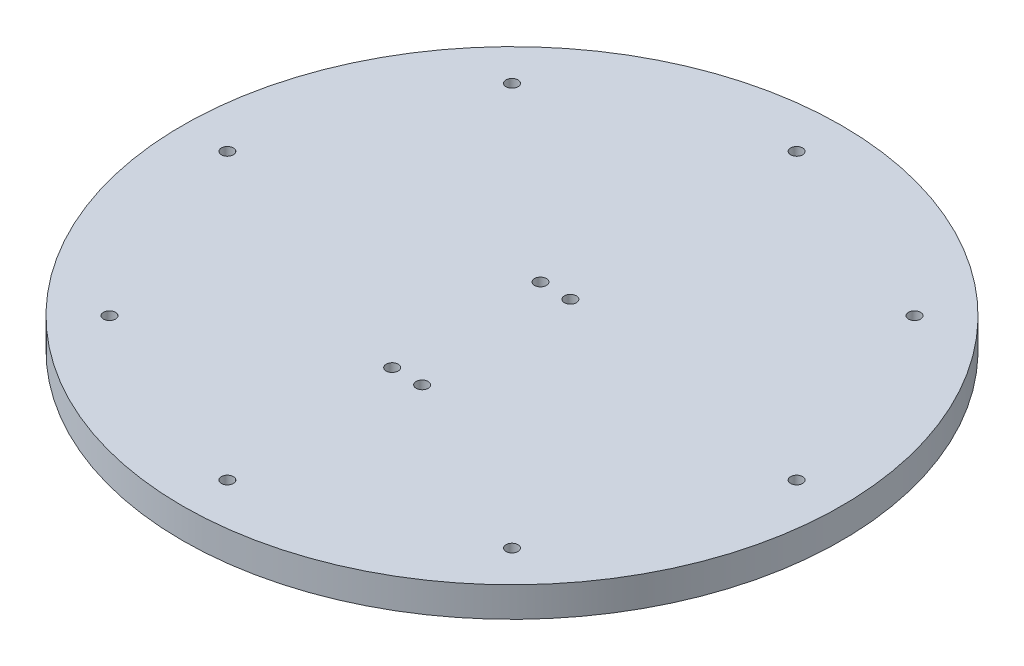
ISO-10303-21;
HEADER;
FILE_DESCRIPTION(('STEP AP214'),'2;1');
FILE_NAME('part.step','',(''),(''),'','','');
FILE_SCHEMA(('AUTOMOTIVE_DESIGN { 1 0 10303 214 1 1 1 1 }'));
ENDSEC;
DATA;
#1=APPLICATION_CONTEXT('core data for automotive mechanical design processes');
#2=APPLICATION_PROTOCOL_DEFINITION('international standard','automotive_design',2000,#1);
#3=PRODUCT_CONTEXT('',#1,'mechanical');
#4=PRODUCT('Part','Part','',(#3));
#5=PRODUCT_RELATED_PRODUCT_CATEGORY('part','',(#4));
#6=PRODUCT_DEFINITION_FORMATION('','',#4);
#7=PRODUCT_DEFINITION_CONTEXT('part definition',#1,'design');
#8=PRODUCT_DEFINITION('design','',#6,#7);
#9=PRODUCT_DEFINITION_SHAPE('','',#8);
#10=(LENGTH_UNIT() NAMED_UNIT(*) SI_UNIT(.MILLI.,.METRE.));
#11=(NAMED_UNIT(*) PLANE_ANGLE_UNIT() SI_UNIT($,.RADIAN.));
#12=(NAMED_UNIT(*) SI_UNIT($,.STERADIAN.) SOLID_ANGLE_UNIT());
#13=UNCERTAINTY_MEASURE_WITH_UNIT(LENGTH_MEASURE(1.E-05),#10,'distance_accuracy_value','');
#14=(GEOMETRIC_REPRESENTATION_CONTEXT(3) GLOBAL_UNCERTAINTY_ASSIGNED_CONTEXT((#13)) GLOBAL_UNIT_ASSIGNED_CONTEXT((#10,
#11,#12)) REPRESENTATION_CONTEXT('',''));
#15=CARTESIAN_POINT('',(0.,0.,0.));
#16=DIRECTION('',(0.,0.,1.));
#17=DIRECTION('',(1.,0.,0.));
#18=AXIS2_PLACEMENT_3D('',#15,#16,#17);
#19=CARTESIAN_POINT('',(-5.,0.,35.));
#20=DIRECTION('',(0.,1.,0.));
#21=DIRECTION('',(0.,0.,1.));
#22=AXIS2_PLACEMENT_3D('',#19,#20,#21);
#23=CYLINDRICAL_SURFACE('',#22,2.);
#24=CARTESIAN_POINT('',(-5.,10.,35.));
#25=DIRECTION('',(0.,1.,0.));
#26=DIRECTION('',(0.,0.,1.));
#27=AXIS2_PLACEMENT_3D('',#24,#25,#26);
#28=CIRCLE('',#27,2.);
#29=CARTESIAN_POINT('',(-5.,10.,37.));
#30=VERTEX_POINT('',#29);
#31=EDGE_CURVE('E105',#30,#30,#28,.T.);
#32=ORIENTED_EDGE('',*,*,#31,.T.);
#33=EDGE_LOOP('',(#32));
#34=FACE_BOUND('',#33,.T.);
#35=CARTESIAN_POINT('',(-5.,6.,35.));
#36=DIRECTION('',(0.,-1.,0.));
#37=DIRECTION('',(0.,0.,-1.));
#38=AXIS2_PLACEMENT_3D('',#35,#36,#37);
#39=CIRCLE('',#38,2.);
#40=CARTESIAN_POINT('',(-5.,6.,33.));
#41=VERTEX_POINT('',#40);
#42=EDGE_CURVE('E38',#41,#41,#39,.F.);
#43=ORIENTED_EDGE('',*,*,#42,.F.);
#44=EDGE_LOOP('',(#43));
#45=FACE_BOUND('',#44,.T.);
#46=ADVANCED_FACE('F34',(#34,#45),#23,.F.);
#47=CARTESIAN_POINT('',(5.,0.,35.));
#48=DIRECTION('',(0.,1.,0.));
#49=DIRECTION('',(0.,0.,1.));
#50=AXIS2_PLACEMENT_3D('',#47,#48,#49);
#51=CYLINDRICAL_SURFACE('',#50,2.);
#52=CARTESIAN_POINT('',(5.,10.,35.));
#53=DIRECTION('',(0.,1.,0.));
#54=DIRECTION('',(0.,0.,1.));
#55=AXIS2_PLACEMENT_3D('',#52,#53,#54);
#56=CIRCLE('',#55,2.);
#57=CARTESIAN_POINT('',(5.,10.,37.));
#58=VERTEX_POINT('',#57);
#59=EDGE_CURVE('E118',#58,#58,#56,.T.);
#60=ORIENTED_EDGE('',*,*,#59,.T.);
#61=EDGE_LOOP('',(#60));
#62=FACE_BOUND('',#61,.T.);
#63=CARTESIAN_POINT('',(5.,6.,35.));
#64=DIRECTION('',(0.,-1.,0.));
#65=DIRECTION('',(0.,0.,-1.));
#66=AXIS2_PLACEMENT_3D('',#63,#64,#65);
#67=CIRCLE('',#66,2.);
#68=CARTESIAN_POINT('',(5.,6.,33.));
#69=VERTEX_POINT('',#68);
#70=EDGE_CURVE('E77',#69,#69,#67,.F.);
#71=ORIENTED_EDGE('',*,*,#70,.F.);
#72=EDGE_LOOP('',(#71));
#73=FACE_BOUND('',#72,.T.);
#74=ADVANCED_FACE('F215',(#62,#73),#51,.F.);
#75=CARTESIAN_POINT('',(5.,0.,-14.5));
#76=DIRECTION('',(0.,1.,0.));
#77=DIRECTION('',(0.,0.,1.));
#78=AXIS2_PLACEMENT_3D('',#75,#76,#77);
#79=CYLINDRICAL_SURFACE('',#78,2.);
#80=CARTESIAN_POINT('',(5.,10.,-14.5));
#81=DIRECTION('',(0.,1.,0.));
#82=DIRECTION('',(0.,0.,1.));
#83=AXIS2_PLACEMENT_3D('',#80,#81,#82);
#84=CIRCLE('',#83,2.);
#85=CARTESIAN_POINT('',(5.,10.,-12.5));
#86=VERTEX_POINT('',#85);
#87=EDGE_CURVE('E122',#86,#86,#84,.T.);
#88=ORIENTED_EDGE('',*,*,#87,.T.);
#89=EDGE_LOOP('',(#88));
#90=FACE_BOUND('',#89,.T.);
#91=CARTESIAN_POINT('',(5.,6.,-14.5));
#92=DIRECTION('',(0.,-1.,0.));
#93=DIRECTION('',(0.,0.,-1.));
#94=AXIS2_PLACEMENT_3D('',#91,#92,#93);
#95=CIRCLE('',#94,2.);
#96=CARTESIAN_POINT('',(5.,6.,-16.5));
#97=VERTEX_POINT('',#96);
#98=EDGE_CURVE('E98',#97,#97,#95,.F.);
#99=ORIENTED_EDGE('',*,*,#98,.F.);
#100=EDGE_LOOP('',(#99));
#101=FACE_BOUND('',#100,.T.);
#102=ADVANCED_FACE('F221',(#90,#101),#79,.F.);
#103=CARTESIAN_POINT('',(-5.,0.,-14.5));
#104=DIRECTION('',(0.,1.,0.));
#105=DIRECTION('',(0.,0.,1.));
#106=AXIS2_PLACEMENT_3D('',#103,#104,#105);
#107=CYLINDRICAL_SURFACE('',#106,2.);
#108=CARTESIAN_POINT('',(-5.,10.,-14.5));
#109=DIRECTION('',(0.,1.,0.));
#110=DIRECTION('',(0.,0.,1.));
#111=AXIS2_PLACEMENT_3D('',#108,#109,#110);
#112=CIRCLE('',#111,2.);
#113=CARTESIAN_POINT('',(-5.,10.,-12.5));
#114=VERTEX_POINT('',#113);
#115=EDGE_CURVE('E119',#114,#114,#112,.T.);
#116=ORIENTED_EDGE('',*,*,#115,.T.);
#117=EDGE_LOOP('',(#116));
#118=FACE_BOUND('',#117,.T.);
#119=CARTESIAN_POINT('',(-5.,6.,-14.5));
#120=DIRECTION('',(0.,-1.,0.));
#121=DIRECTION('',(0.,0.,-1.));
#122=AXIS2_PLACEMENT_3D('',#119,#120,#121);
#123=CIRCLE('',#122,2.);
#124=CARTESIAN_POINT('',(-5.,6.,-16.5));
#125=VERTEX_POINT('',#124);
#126=EDGE_CURVE('E109',#125,#125,#123,.F.);
#127=ORIENTED_EDGE('',*,*,#126,.F.);
#128=EDGE_LOOP('',(#127));
#129=FACE_BOUND('',#128,.T.);
#130=ADVANCED_FACE('F209',(#118,#129),#107,.F.);
#131=CARTESIAN_POINT('',(0.,10.,0.));
#132=DIRECTION('',(0.,-1.,0.));
#133=DIRECTION('',(0.,0.,-1.));
#134=AXIS2_PLACEMENT_3D('',#131,#132,#133);
#135=CYLINDRICAL_SURFACE('',#134,110.);
#136=CARTESIAN_POINT('',(0.,10.,0.));
#137=DIRECTION('',(0.,1.,0.));
#138=DIRECTION('',(0.,0.,1.));
#139=AXIS2_PLACEMENT_3D('',#136,#137,#138);
#140=CIRCLE('',#139,110.);
#141=CARTESIAN_POINT('',(0.,10.,110.));
#142=VERTEX_POINT('',#141);
#143=EDGE_CURVE('E10',#142,#142,#140,.T.);
#144=ORIENTED_EDGE('',*,*,#143,.F.);
#145=EDGE_LOOP('',(#144));
#146=FACE_BOUND('',#145,.T.);
#147=CARTESIAN_POINT('',(0.,0.,0.));
#148=DIRECTION('',(0.,1.,0.));
#149=DIRECTION('',(0.,0.,1.));
#150=AXIS2_PLACEMENT_3D('',#147,#148,#149);
#151=CIRCLE('',#150,110.);
#152=CARTESIAN_POINT('',(0.,0.,110.));
#153=VERTEX_POINT('',#152);
#154=EDGE_CURVE('E42',#153,#153,#151,.T.);
#155=ORIENTED_EDGE('',*,*,#154,.T.);
#156=EDGE_LOOP('',(#155));
#157=FACE_BOUND('',#156,.T.);
#158=ADVANCED_FACE('F36',(#146,#157),#135,.T.);
#159=CARTESIAN_POINT('',(0.,10.,0.));
#160=DIRECTION('',(0.,1.,0.));
#161=DIRECTION('',(0.,0.,1.));
#162=AXIS2_PLACEMENT_3D('',#159,#160,#161);
#163=PLANE('',#162);
#164=ORIENTED_EDGE('',*,*,#115,.F.);
#165=EDGE_LOOP('',(#164));
#166=FACE_BOUND('',#165,.T.);
#167=ORIENTED_EDGE('',*,*,#59,.F.);
#168=EDGE_LOOP('',(#167));
#169=FACE_BOUND('',#168,.T.);
#170=ORIENTED_EDGE('',*,*,#31,.F.);
#171=EDGE_LOOP('',(#170));
#172=FACE_BOUND('',#171,.T.);
#173=ORIENTED_EDGE('',*,*,#87,.F.);
#174=EDGE_LOOP('',(#173));
#175=FACE_BOUND('',#174,.T.);
#176=CARTESIAN_POINT('',(0.,10.,-95.));
#177=DIRECTION('',(0.,1.,0.));
#178=DIRECTION('',(0.,0.,1.));
#179=AXIS2_PLACEMENT_3D('',#176,#177,#178);
#180=CIRCLE('',#179,2.);
#181=CARTESIAN_POINT('',(0.,10.,-93.));
#182=VERTEX_POINT('',#181);
#183=EDGE_CURVE('E47',#182,#182,#180,.T.);
#184=ORIENTED_EDGE('',*,*,#183,.F.);
#185=EDGE_LOOP('',(#184));
#186=FACE_BOUND('',#185,.T.);
#187=CARTESIAN_POINT('',(67.1751442127244,10.,-67.1751442127277));
#188=DIRECTION('',(0.,1.,0.));
#189=DIRECTION('',(0.,0.,1.));
#190=AXIS2_PLACEMENT_3D('',#187,#188,#189);
#191=CIRCLE('',#190,2.00000000000076);
#192=CARTESIAN_POINT('',(67.1751442127244,10.,-65.175144212727));
#193=VERTEX_POINT('',#192);
#194=EDGE_CURVE('E176',#193,#193,#191,.T.);
#195=ORIENTED_EDGE('',*,*,#194,.F.);
#196=EDGE_LOOP('',(#195));
#197=FACE_BOUND('',#196,.T.);
#198=CARTESIAN_POINT('',(95.0000000000081,10.,-8.08273597077729E-12));
#199=DIRECTION('',(0.,1.,0.));
#200=DIRECTION('',(0.,0.,1.));
#201=AXIS2_PLACEMENT_3D('',#198,#199,#200);
#202=CIRCLE('',#201,2.00000000000569);
#203=CARTESIAN_POINT('',(95.0000000000081,10.,1.99999999999761));
#204=VERTEX_POINT('',#203);
#205=EDGE_CURVE('E179',#204,#204,#202,.T.);
#206=ORIENTED_EDGE('',*,*,#205,.F.);
#207=EDGE_LOOP('',(#206));
#208=FACE_BOUND('',#207,.T.);
#209=CARTESIAN_POINT('',(67.1751442127358,10.,67.1751442127163));
#210=DIRECTION('',(0.,1.,0.));
#211=DIRECTION('',(0.,0.,1.));
#212=AXIS2_PLACEMENT_3D('',#209,#210,#211);
#213=CIRCLE('',#212,2.000000000012);
#214=CARTESIAN_POINT('',(67.1751442127358,10.,69.1751442127283));
#215=VERTEX_POINT('',#214);
#216=EDGE_CURVE('E182',#215,#215,#213,.T.);
#217=ORIENTED_EDGE('',*,*,#216,.F.);
#218=EDGE_LOOP('',(#217));
#219=FACE_BOUND('',#218,.T.);
#220=CARTESIAN_POINT('',(1.61654719415546E-11,10.,95.));
#221=DIRECTION('',(0.,1.,0.));
#222=DIRECTION('',(0.,0.,1.));
#223=AXIS2_PLACEMENT_3D('',#220,#221,#222);
#224=CIRCLE('',#223,2.00000000001609);
#225=CARTESIAN_POINT('',(1.61654719415546E-11,10.,97.0000000000161));
#226=VERTEX_POINT('',#225);
#227=EDGE_CURVE('E185',#226,#226,#224,.T.);
#228=ORIENTED_EDGE('',*,*,#227,.F.);
#229=EDGE_LOOP('',(#228));
#230=FACE_BOUND('',#229,.T.);
#231=CARTESIAN_POINT('',(-67.1751442127082,10.,67.1751442127277));
#232=DIRECTION('',(0.,1.,0.));
#233=DIRECTION('',(0.,0.,1.));
#234=AXIS2_PLACEMENT_3D('',#231,#232,#233);
#235=CIRCLE('',#234,2.00000000001567);
#236=CARTESIAN_POINT('',(-67.1751442127082,10.,69.1751442127434));
#237=VERTEX_POINT('',#236);
#238=EDGE_CURVE('E188',#237,#237,#235,.T.);
#239=ORIENTED_EDGE('',*,*,#238,.F.);
#240=EDGE_LOOP('',(#239));
#241=FACE_BOUND('',#240,.T.);
#242=CARTESIAN_POINT('',(-94.9999999999919,10.,8.09437011536919E-12));
#243=DIRECTION('',(0.,1.,0.));
#244=DIRECTION('',(0.,0.,1.));
#245=AXIS2_PLACEMENT_3D('',#242,#243,#244);
#246=CIRCLE('',#245,2.00000000001106);
#247=CARTESIAN_POINT('',(-94.9999999999919,10.,2.00000000001915));
#248=VERTEX_POINT('',#247);
#249=EDGE_CURVE('E190',#248,#248,#246,.T.);
#250=ORIENTED_EDGE('',*,*,#249,.F.);
#251=EDGE_LOOP('',(#250));
#252=FACE_BOUND('',#251,.T.);
#253=CARTESIAN_POINT('',(-67.1751442127197,10.,-67.1751442127163));
#254=DIRECTION('',(0.,1.,0.));
#255=DIRECTION('',(0.,0.,1.));
#256=AXIS2_PLACEMENT_3D('',#253,#254,#255);
#257=CIRCLE('',#256,2.00000000000508);
#258=CARTESIAN_POINT('',(-67.1751442127197,10.,-65.1751442127112));
#259=VERTEX_POINT('',#258);
#260=EDGE_CURVE('E50',#259,#259,#257,.T.);
#261=ORIENTED_EDGE('',*,*,#260,.F.);
#262=EDGE_LOOP('',(#261));
#263=FACE_BOUND('',#262,.T.);
#264=ORIENTED_EDGE('',*,*,#143,.T.);
#265=EDGE_LOOP('',(#264));
#266=FACE_BOUND('',#265,.T.);
#267=ADVANCED_FACE('F199',(#166,#169,#172,#175,#186,#197,#208,#219,#230,#241,#252,#263,#266),
#163,.T.);
#268=CARTESIAN_POINT('',(0.,0.,0.));
#269=DIRECTION('',(0.,1.,0.));
#270=DIRECTION('',(0.,0.,1.));
#271=AXIS2_PLACEMENT_3D('',#268,#269,#270);
#272=PLANE('',#271);
#273=CARTESIAN_POINT('',(5.,0.,35.));
#274=DIRECTION('',(0.,-1.,0.));
#275=DIRECTION('',(0.,0.,-1.));
#276=AXIS2_PLACEMENT_3D('',#273,#274,#275);
#277=CIRCLE('',#276,4.5);
#278=CARTESIAN_POINT('',(5.,0.,30.5));
#279=VERTEX_POINT('',#278);
#280=EDGE_CURVE('E85',#279,#279,#277,.T.);
#281=ORIENTED_EDGE('',*,*,#280,.F.);
#282=EDGE_LOOP('',(#281));
#283=FACE_BOUND('',#282,.T.);
#284=CARTESIAN_POINT('',(-5.,0.,35.));
#285=DIRECTION('',(0.,-1.,0.));
#286=DIRECTION('',(0.,0.,-1.));
#287=AXIS2_PLACEMENT_3D('',#284,#285,#286);
#288=CIRCLE('',#287,4.5);
#289=CARTESIAN_POINT('',(-5.,0.,30.5));
#290=VERTEX_POINT('',#289);
#291=EDGE_CURVE('E95',#290,#290,#288,.T.);
#292=ORIENTED_EDGE('',*,*,#291,.F.);
#293=EDGE_LOOP('',(#292));
#294=FACE_BOUND('',#293,.T.);
#295=CARTESIAN_POINT('',(5.,0.,-14.5));
#296=DIRECTION('',(0.,-1.,0.));
#297=DIRECTION('',(0.,0.,-1.));
#298=AXIS2_PLACEMENT_3D('',#295,#296,#297);
#299=CIRCLE('',#298,4.5);
#300=CARTESIAN_POINT('',(5.,0.,-19.));
#301=VERTEX_POINT('',#300);
#302=EDGE_CURVE('E102',#301,#301,#299,.T.);
#303=ORIENTED_EDGE('',*,*,#302,.F.);
#304=EDGE_LOOP('',(#303));
#305=FACE_BOUND('',#304,.T.);
#306=CARTESIAN_POINT('',(-5.,0.,-14.5));
#307=DIRECTION('',(0.,-1.,0.));
#308=DIRECTION('',(0.,0.,-1.));
#309=AXIS2_PLACEMENT_3D('',#306,#307,#308);
#310=CIRCLE('',#309,4.5);
#311=CARTESIAN_POINT('',(-5.,0.,-19.));
#312=VERTEX_POINT('',#311);
#313=EDGE_CURVE('E83',#312,#312,#310,.T.);
#314=ORIENTED_EDGE('',*,*,#313,.F.);
#315=EDGE_LOOP('',(#314));
#316=FACE_BOUND('',#315,.T.);
#317=CARTESIAN_POINT('',(0.,0.,-95.));
#318=DIRECTION('',(0.,1.,0.));
#319=DIRECTION('',(0.,0.,1.));
#320=AXIS2_PLACEMENT_3D('',#317,#318,#319);
#321=CIRCLE('',#320,5.);
#322=CARTESIAN_POINT('',(0.,0.,-90.));
#323=VERTEX_POINT('',#322);
#324=EDGE_CURVE('E130',#323,#323,#321,.T.);
#325=ORIENTED_EDGE('',*,*,#324,.T.);
#326=EDGE_LOOP('',(#325));
#327=FACE_BOUND('',#326,.T.);
#328=CARTESIAN_POINT('',(67.1751442127244,0.,-67.1751442127277));
#329=DIRECTION('',(0.,1.,0.));
#330=DIRECTION('',(0.,0.,1.));
#331=AXIS2_PLACEMENT_3D('',#328,#329,#330);
#332=CIRCLE('',#331,5.00000000000076);
#333=CARTESIAN_POINT('',(67.1751442127244,0.,-62.175144212727));
#334=VERTEX_POINT('',#333);
#335=EDGE_CURVE('E136',#334,#334,#332,.T.);
#336=ORIENTED_EDGE('',*,*,#335,.T.);
#337=EDGE_LOOP('',(#336));
#338=FACE_BOUND('',#337,.T.);
#339=CARTESIAN_POINT('',(95.0000000000081,0.,-8.08273597077729E-12));
#340=DIRECTION('',(0.,1.,0.));
#341=DIRECTION('',(0.,0.,1.));
#342=AXIS2_PLACEMENT_3D('',#339,#340,#341);
#343=CIRCLE('',#342,5.00000000000569);
#344=CARTESIAN_POINT('',(95.0000000000081,0.,4.9999999999976));
#345=VERTEX_POINT('',#344);
#346=EDGE_CURVE('E142',#345,#345,#343,.T.);
#347=ORIENTED_EDGE('',*,*,#346,.T.);
#348=EDGE_LOOP('',(#347));
#349=FACE_BOUND('',#348,.T.);
#350=CARTESIAN_POINT('',(67.1751442127358,0.,67.1751442127163));
#351=DIRECTION('',(0.,1.,0.));
#352=DIRECTION('',(0.,0.,1.));
#353=AXIS2_PLACEMENT_3D('',#350,#351,#352);
#354=CIRCLE('',#353,5.00000000001201);
#355=CARTESIAN_POINT('',(67.1751442127358,0.,72.1751442127283));
#356=VERTEX_POINT('',#355);
#357=EDGE_CURVE('E148',#356,#356,#354,.T.);
#358=ORIENTED_EDGE('',*,*,#357,.T.);
#359=EDGE_LOOP('',(#358));
#360=FACE_BOUND('',#359,.T.);
#361=CARTESIAN_POINT('',(1.61654719415546E-11,0.,95.));
#362=DIRECTION('',(0.,1.,0.));
#363=DIRECTION('',(0.,0.,1.));
#364=AXIS2_PLACEMENT_3D('',#361,#362,#363);
#365=CIRCLE('',#364,5.0000000000161);
#366=CARTESIAN_POINT('',(1.61654719415546E-11,0.,100.000000000016));
#367=VERTEX_POINT('',#366);
#368=EDGE_CURVE('E154',#367,#367,#365,.T.);
#369=ORIENTED_EDGE('',*,*,#368,.T.);
#370=EDGE_LOOP('',(#369));
#371=FACE_BOUND('',#370,.T.);
#372=CARTESIAN_POINT('',(-67.1751442127082,0.,67.1751442127277));
#373=DIRECTION('',(0.,1.,0.));
#374=DIRECTION('',(0.,0.,1.));
#375=AXIS2_PLACEMENT_3D('',#372,#373,#374);
#376=CIRCLE('',#375,5.00000000001567);
#377=CARTESIAN_POINT('',(-67.1751442127082,0.,72.1751442127434));
#378=VERTEX_POINT('',#377);
#379=EDGE_CURVE('E160',#378,#378,#376,.T.);
#380=ORIENTED_EDGE('',*,*,#379,.T.);
#381=EDGE_LOOP('',(#380));
#382=FACE_BOUND('',#381,.T.);
#383=CARTESIAN_POINT('',(-94.9999999999919,0.,8.09437011536919E-12));
#384=DIRECTION('',(0.,1.,0.));
#385=DIRECTION('',(0.,0.,1.));
#386=AXIS2_PLACEMENT_3D('',#383,#384,#385);
#387=CIRCLE('',#386,5.00000000001106);
#388=CARTESIAN_POINT('',(-94.9999999999919,0.,5.00000000001915));
#389=VERTEX_POINT('',#388);
#390=EDGE_CURVE('E166',#389,#389,#387,.T.);
#391=ORIENTED_EDGE('',*,*,#390,.T.);
#392=EDGE_LOOP('',(#391));
#393=FACE_BOUND('',#392,.T.);
#394=CARTESIAN_POINT('',(-67.1751442127197,0.,-67.1751442127163));
#395=DIRECTION('',(0.,1.,0.));
#396=DIRECTION('',(0.,0.,1.));
#397=AXIS2_PLACEMENT_3D('',#394,#395,#396);
#398=CIRCLE('',#397,5.00000000000509);
#399=CARTESIAN_POINT('',(-67.1751442127197,0.,-62.1751442127112));
#400=VERTEX_POINT('',#399);
#401=EDGE_CURVE('E127',#400,#400,#398,.T.);
#402=ORIENTED_EDGE('',*,*,#401,.T.);
#403=EDGE_LOOP('',(#402));
#404=FACE_BOUND('',#403,.T.);
#405=ORIENTED_EDGE('',*,*,#154,.F.);
#406=EDGE_LOOP('',(#405));
#407=FACE_BOUND('',#406,.T.);
#408=ADVANCED_FACE('F201',(#283,#294,#305,#316,#327,#338,#349,#360,#371,#382,#393,#404,#407),
#272,.F.);
#409=CARTESIAN_POINT('',(-67.1751442127197,0.,-67.1751442127163));
#410=DIRECTION('',(0.,1.,0.));
#411=DIRECTION('',(0.,0.,1.));
#412=AXIS2_PLACEMENT_3D('',#409,#410,#411);
#413=CYLINDRICAL_SURFACE('',#412,2.00000000000508);
#414=CARTESIAN_POINT('',(-67.1751442127197,6.,-67.1751442127163));
#415=DIRECTION('',(0.,1.,0.));
#416=DIRECTION('',(0.,0.,1.));
#417=AXIS2_PLACEMENT_3D('',#414,#415,#416);
#418=CIRCLE('',#417,2.00000000000508);
#419=CARTESIAN_POINT('',(-67.1751442127197,6.,-65.1751442127112));
#420=VERTEX_POINT('',#419);
#421=EDGE_CURVE('E75',#420,#420,#418,.F.);
#422=ORIENTED_EDGE('',*,*,#421,.T.);
#423=EDGE_LOOP('',(#422));
#424=FACE_BOUND('',#423,.T.);
#425=ORIENTED_EDGE('',*,*,#260,.T.);
#426=EDGE_LOOP('',(#425));
#427=FACE_BOUND('',#426,.T.);
#428=ADVANCED_FACE('F197',(#424,#427),#413,.F.);
#429=CARTESIAN_POINT('',(-94.9999999999919,0.,8.09437011536919E-12));
#430=DIRECTION('',(0.,1.,0.));
#431=DIRECTION('',(0.,0.,1.));
#432=AXIS2_PLACEMENT_3D('',#429,#430,#431);
#433=CYLINDRICAL_SURFACE('',#432,2.00000000001106);
#434=CARTESIAN_POINT('',(-94.9999999999919,6.,8.09437011536919E-12));
#435=DIRECTION('',(0.,1.,0.));
#436=DIRECTION('',(0.,0.,1.));
#437=AXIS2_PLACEMENT_3D('',#434,#435,#436);
#438=CIRCLE('',#437,2.00000000001106);
#439=CARTESIAN_POINT('',(-94.9999999999919,6.,2.00000000001915));
#440=VERTEX_POINT('',#439);
#441=EDGE_CURVE('E72',#440,#440,#438,.F.);
#442=ORIENTED_EDGE('',*,*,#441,.T.);
#443=EDGE_LOOP('',(#442));
#444=FACE_BOUND('',#443,.T.);
#445=ORIENTED_EDGE('',*,*,#249,.T.);
#446=EDGE_LOOP('',(#445));
#447=FACE_BOUND('',#446,.T.);
#448=ADVANCED_FACE('F322',(#444,#447),#433,.F.);
#449=CARTESIAN_POINT('',(-67.1751442127082,0.,67.1751442127277));
#450=DIRECTION('',(0.,1.,0.));
#451=DIRECTION('',(0.,0.,1.));
#452=AXIS2_PLACEMENT_3D('',#449,#450,#451);
#453=CYLINDRICAL_SURFACE('',#452,2.00000000001567);
#454=CARTESIAN_POINT('',(-67.1751442127082,6.,67.1751442127277));
#455=DIRECTION('',(0.,1.,0.));
#456=DIRECTION('',(0.,0.,1.));
#457=AXIS2_PLACEMENT_3D('',#454,#455,#456);
#458=CIRCLE('',#457,2.00000000001567);
#459=CARTESIAN_POINT('',(-67.1751442127082,6.,69.1751442127434));
#460=VERTEX_POINT('',#459);
#461=EDGE_CURVE('E69',#460,#460,#458,.F.);
#462=ORIENTED_EDGE('',*,*,#461,.T.);
#463=EDGE_LOOP('',(#462));
#464=FACE_BOUND('',#463,.T.);
#465=ORIENTED_EDGE('',*,*,#238,.T.);
#466=EDGE_LOOP('',(#465));
#467=FACE_BOUND('',#466,.T.);
#468=ADVANCED_FACE('F318',(#464,#467),#453,.F.);
#469=CARTESIAN_POINT('',(1.61654719415546E-11,0.,95.));
#470=DIRECTION('',(0.,1.,0.));
#471=DIRECTION('',(0.,0.,1.));
#472=AXIS2_PLACEMENT_3D('',#469,#470,#471);
#473=CYLINDRICAL_SURFACE('',#472,2.00000000001609);
#474=CARTESIAN_POINT('',(1.61654719415546E-11,6.,95.));
#475=DIRECTION('',(0.,1.,0.));
#476=DIRECTION('',(0.,0.,1.));
#477=AXIS2_PLACEMENT_3D('',#474,#475,#476);
#478=CIRCLE('',#477,2.00000000001609);
#479=CARTESIAN_POINT('',(1.61654719415546E-11,6.,97.0000000000161));
#480=VERTEX_POINT('',#479);
#481=EDGE_CURVE('E66',#480,#480,#478,.F.);
#482=ORIENTED_EDGE('',*,*,#481,.T.);
#483=EDGE_LOOP('',(#482));
#484=FACE_BOUND('',#483,.T.);
#485=ORIENTED_EDGE('',*,*,#227,.T.);
#486=EDGE_LOOP('',(#485));
#487=FACE_BOUND('',#486,.T.);
#488=ADVANCED_FACE('F314',(#484,#487),#473,.F.);
#489=CARTESIAN_POINT('',(67.1751442127358,0.,67.1751442127163));
#490=DIRECTION('',(0.,1.,0.));
#491=DIRECTION('',(0.,0.,1.));
#492=AXIS2_PLACEMENT_3D('',#489,#490,#491);
#493=CYLINDRICAL_SURFACE('',#492,2.000000000012);
#494=CARTESIAN_POINT('',(67.1751442127358,6.,67.1751442127163));
#495=DIRECTION('',(0.,1.,0.));
#496=DIRECTION('',(0.,0.,1.));
#497=AXIS2_PLACEMENT_3D('',#494,#495,#496);
#498=CIRCLE('',#497,2.000000000012);
#499=CARTESIAN_POINT('',(67.1751442127358,6.,69.1751442127283));
#500=VERTEX_POINT('',#499);
#501=EDGE_CURVE('E63',#500,#500,#498,.F.);
#502=ORIENTED_EDGE('',*,*,#501,.T.);
#503=EDGE_LOOP('',(#502));
#504=FACE_BOUND('',#503,.T.);
#505=ORIENTED_EDGE('',*,*,#216,.T.);
#506=EDGE_LOOP('',(#505));
#507=FACE_BOUND('',#506,.T.);
#508=ADVANCED_FACE('F310',(#504,#507),#493,.F.);
#509=CARTESIAN_POINT('',(95.0000000000081,0.,-8.08273597077729E-12));
#510=DIRECTION('',(0.,1.,0.));
#511=DIRECTION('',(0.,0.,1.));
#512=AXIS2_PLACEMENT_3D('',#509,#510,#511);
#513=CYLINDRICAL_SURFACE('',#512,2.00000000000569);
#514=CARTESIAN_POINT('',(95.0000000000081,6.,-8.08273597077729E-12));
#515=DIRECTION('',(0.,1.,0.));
#516=DIRECTION('',(0.,0.,1.));
#517=AXIS2_PLACEMENT_3D('',#514,#515,#516);
#518=CIRCLE('',#517,2.00000000000569);
#519=CARTESIAN_POINT('',(95.0000000000081,6.,1.99999999999761));
#520=VERTEX_POINT('',#519);
#521=EDGE_CURVE('E60',#520,#520,#518,.F.);
#522=ORIENTED_EDGE('',*,*,#521,.T.);
#523=EDGE_LOOP('',(#522));
#524=FACE_BOUND('',#523,.T.);
#525=ORIENTED_EDGE('',*,*,#205,.T.);
#526=EDGE_LOOP('',(#525));
#527=FACE_BOUND('',#526,.T.);
#528=ADVANCED_FACE('F306',(#524,#527),#513,.F.);
#529=CARTESIAN_POINT('',(67.1751442127244,0.,-67.1751442127277));
#530=DIRECTION('',(0.,1.,0.));
#531=DIRECTION('',(0.,0.,1.));
#532=AXIS2_PLACEMENT_3D('',#529,#530,#531);
#533=CYLINDRICAL_SURFACE('',#532,2.00000000000076);
#534=CARTESIAN_POINT('',(67.1751442127244,6.,-67.1751442127277));
#535=DIRECTION('',(0.,1.,0.));
#536=DIRECTION('',(0.,0.,1.));
#537=AXIS2_PLACEMENT_3D('',#534,#535,#536);
#538=CIRCLE('',#537,2.00000000000076);
#539=CARTESIAN_POINT('',(67.1751442127244,6.,-65.175144212727));
#540=VERTEX_POINT('',#539);
#541=EDGE_CURVE('E56',#540,#540,#538,.F.);
#542=ORIENTED_EDGE('',*,*,#541,.T.);
#543=EDGE_LOOP('',(#542));
#544=FACE_BOUND('',#543,.T.);
#545=ORIENTED_EDGE('',*,*,#194,.T.);
#546=EDGE_LOOP('',(#545));
#547=FACE_BOUND('',#546,.T.);
#548=ADVANCED_FACE('F302',(#544,#547),#533,.F.);
#549=CARTESIAN_POINT('',(0.,0.,-95.));
#550=DIRECTION('',(0.,1.,0.));
#551=DIRECTION('',(0.,0.,1.));
#552=AXIS2_PLACEMENT_3D('',#549,#550,#551);
#553=CYLINDRICAL_SURFACE('',#552,2.);
#554=CARTESIAN_POINT('',(0.,6.,-95.));
#555=DIRECTION('',(0.,1.,0.));
#556=DIRECTION('',(0.,0.,1.));
#557=AXIS2_PLACEMENT_3D('',#554,#555,#556);
#558=CIRCLE('',#557,2.);
#559=CARTESIAN_POINT('',(0.,6.,-93.));
#560=VERTEX_POINT('',#559);
#561=EDGE_CURVE('E53',#560,#560,#558,.F.);
#562=ORIENTED_EDGE('',*,*,#561,.T.);
#563=EDGE_LOOP('',(#562));
#564=FACE_BOUND('',#563,.T.);
#565=ORIENTED_EDGE('',*,*,#183,.T.);
#566=EDGE_LOOP('',(#565));
#567=FACE_BOUND('',#566,.T.);
#568=ADVANCED_FACE('F239',(#564,#567),#553,.F.);
#569=CARTESIAN_POINT('',(0.,6.,-95.));
#570=DIRECTION('',(0.,1.,0.));
#571=DIRECTION('',(0.,0.,1.));
#572=AXIS2_PLACEMENT_3D('',#569,#570,#571);
#573=PLANE('',#572);
#574=CARTESIAN_POINT('',(0.,6.,-95.));
#575=DIRECTION('',(0.,1.,0.));
#576=DIRECTION('',(0.,0.,1.));
#577=AXIS2_PLACEMENT_3D('',#574,#575,#576);
#578=CIRCLE('',#577,5.);
#579=CARTESIAN_POINT('',(0.,6.,-90.));
#580=VERTEX_POINT('',#579);
#581=EDGE_CURVE('E57',#580,#580,#578,.T.);
#582=ORIENTED_EDGE('',*,*,#581,.F.);
#583=EDGE_LOOP('',(#582));
#584=FACE_BOUND('',#583,.T.);
#585=ORIENTED_EDGE('',*,*,#561,.F.);
#586=EDGE_LOOP('',(#585));
#587=FACE_BOUND('',#586,.T.);
#588=ADVANCED_FACE('F235',(#584,#587),#573,.F.);
#589=CARTESIAN_POINT('',(0.,6.,-95.));
#590=DIRECTION('',(0.,-1.,0.));
#591=DIRECTION('',(0.,0.,-1.));
#592=AXIS2_PLACEMENT_3D('',#589,#590,#591);
#593=CYLINDRICAL_SURFACE('',#592,5.);
#594=ORIENTED_EDGE('',*,*,#581,.T.);
#595=EDGE_LOOP('',(#594));
#596=FACE_BOUND('',#595,.T.);
#597=ORIENTED_EDGE('',*,*,#324,.F.);
#598=EDGE_LOOP('',(#597));
#599=FACE_BOUND('',#598,.T.);
#600=ADVANCED_FACE('F238',(#596,#599),#593,.F.);
#601=CARTESIAN_POINT('',(67.1751442127244,6.,-67.1751442127277));
#602=DIRECTION('',(0.,1.,0.));
#603=DIRECTION('',(0.,0.,1.));
#604=AXIS2_PLACEMENT_3D('',#601,#602,#603);
#605=PLANE('',#604);
#606=CARTESIAN_POINT('',(67.1751442127244,6.,-67.1751442127277));
#607=DIRECTION('',(0.,1.,0.));
#608=DIRECTION('',(0.,0.,1.));
#609=AXIS2_PLACEMENT_3D('',#606,#607,#608);
#610=CIRCLE('',#609,5.00000000000076);
#611=CARTESIAN_POINT('',(67.1751442127244,6.,-62.175144212727));
#612=VERTEX_POINT('',#611);
#613=EDGE_CURVE('E133',#612,#612,#610,.T.);
#614=ORIENTED_EDGE('',*,*,#613,.F.);
#615=EDGE_LOOP('',(#614));
#616=FACE_BOUND('',#615,.T.);
#617=ORIENTED_EDGE('',*,*,#541,.F.);
#618=EDGE_LOOP('',(#617));
#619=FACE_BOUND('',#618,.T.);
#620=ADVANCED_FACE('F243',(#616,#619),#605,.F.);
#621=CARTESIAN_POINT('',(67.1751442127244,6.,-67.1751442127277));
#622=DIRECTION('',(0.,-1.,0.));
#623=DIRECTION('',(0.,0.,-1.));
#624=AXIS2_PLACEMENT_3D('',#621,#622,#623);
#625=CYLINDRICAL_SURFACE('',#624,5.00000000000076);
#626=ORIENTED_EDGE('',*,*,#613,.T.);
#627=EDGE_LOOP('',(#626));
#628=FACE_BOUND('',#627,.T.);
#629=ORIENTED_EDGE('',*,*,#335,.F.);
#630=EDGE_LOOP('',(#629));
#631=FACE_BOUND('',#630,.T.);
#632=ADVANCED_FACE('F247',(#628,#631),#625,.F.);
#633=CARTESIAN_POINT('',(95.0000000000081,6.,-8.08273597077729E-12));
#634=DIRECTION('',(0.,1.,0.));
#635=DIRECTION('',(0.,0.,1.));
#636=AXIS2_PLACEMENT_3D('',#633,#634,#635);
#637=PLANE('',#636);
#638=CARTESIAN_POINT('',(95.0000000000081,6.,-8.08273597077729E-12));
#639=DIRECTION('',(0.,1.,0.));
#640=DIRECTION('',(0.,0.,1.));
#641=AXIS2_PLACEMENT_3D('',#638,#639,#640);
#642=CIRCLE('',#641,5.00000000000569);
#643=CARTESIAN_POINT('',(95.0000000000081,6.,4.9999999999976));
#644=VERTEX_POINT('',#643);
#645=EDGE_CURVE('E139',#644,#644,#642,.T.);
#646=ORIENTED_EDGE('',*,*,#645,.F.);
#647=EDGE_LOOP('',(#646));
#648=FACE_BOUND('',#647,.T.);
#649=ORIENTED_EDGE('',*,*,#521,.F.);
#650=EDGE_LOOP('',(#649));
#651=FACE_BOUND('',#650,.T.);
#652=ADVANCED_FACE('F251',(#648,#651),#637,.F.);
#653=CARTESIAN_POINT('',(95.0000000000081,6.,-8.08273597077729E-12));
#654=DIRECTION('',(0.,-1.,0.));
#655=DIRECTION('',(0.,0.,-1.));
#656=AXIS2_PLACEMENT_3D('',#653,#654,#655);
#657=CYLINDRICAL_SURFACE('',#656,5.00000000000569);
#658=ORIENTED_EDGE('',*,*,#645,.T.);
#659=EDGE_LOOP('',(#658));
#660=FACE_BOUND('',#659,.T.);
#661=ORIENTED_EDGE('',*,*,#346,.F.);
#662=EDGE_LOOP('',(#661));
#663=FACE_BOUND('',#662,.T.);
#664=ADVANCED_FACE('F255',(#660,#663),#657,.F.);
#665=CARTESIAN_POINT('',(67.1751442127358,6.,67.1751442127163));
#666=DIRECTION('',(0.,1.,0.));
#667=DIRECTION('',(0.,0.,1.));
#668=AXIS2_PLACEMENT_3D('',#665,#666,#667);
#669=PLANE('',#668);
#670=CARTESIAN_POINT('',(67.1751442127358,6.,67.1751442127163));
#671=DIRECTION('',(0.,1.,0.));
#672=DIRECTION('',(0.,0.,1.));
#673=AXIS2_PLACEMENT_3D('',#670,#671,#672);
#674=CIRCLE('',#673,5.00000000001201);
#675=CARTESIAN_POINT('',(67.1751442127358,6.,72.1751442127283));
#676=VERTEX_POINT('',#675);
#677=EDGE_CURVE('E145',#676,#676,#674,.T.);
#678=ORIENTED_EDGE('',*,*,#677,.F.);
#679=EDGE_LOOP('',(#678));
#680=FACE_BOUND('',#679,.T.);
#681=ORIENTED_EDGE('',*,*,#501,.F.);
#682=EDGE_LOOP('',(#681));
#683=FACE_BOUND('',#682,.T.);
#684=ADVANCED_FACE('F259',(#680,#683),#669,.F.);
#685=CARTESIAN_POINT('',(67.1751442127358,6.,67.1751442127163));
#686=DIRECTION('',(0.,-1.,0.));
#687=DIRECTION('',(0.,0.,-1.));
#688=AXIS2_PLACEMENT_3D('',#685,#686,#687);
#689=CYLINDRICAL_SURFACE('',#688,5.00000000001201);
#690=ORIENTED_EDGE('',*,*,#677,.T.);
#691=EDGE_LOOP('',(#690));
#692=FACE_BOUND('',#691,.T.);
#693=ORIENTED_EDGE('',*,*,#357,.F.);
#694=EDGE_LOOP('',(#693));
#695=FACE_BOUND('',#694,.T.);
#696=ADVANCED_FACE('F263',(#692,#695),#689,.F.);
#697=CARTESIAN_POINT('',(1.61654719415546E-11,6.,95.));
#698=DIRECTION('',(0.,1.,0.));
#699=DIRECTION('',(0.,0.,1.));
#700=AXIS2_PLACEMENT_3D('',#697,#698,#699);
#701=PLANE('',#700);
#702=CARTESIAN_POINT('',(1.61654719415546E-11,6.,95.));
#703=DIRECTION('',(0.,1.,0.));
#704=DIRECTION('',(0.,0.,1.));
#705=AXIS2_PLACEMENT_3D('',#702,#703,#704);
#706=CIRCLE('',#705,5.0000000000161);
#707=CARTESIAN_POINT('',(1.61654719415546E-11,6.,100.000000000016));
#708=VERTEX_POINT('',#707);
#709=EDGE_CURVE('E151',#708,#708,#706,.T.);
#710=ORIENTED_EDGE('',*,*,#709,.F.);
#711=EDGE_LOOP('',(#710));
#712=FACE_BOUND('',#711,.T.);
#713=ORIENTED_EDGE('',*,*,#481,.F.);
#714=EDGE_LOOP('',(#713));
#715=FACE_BOUND('',#714,.T.);
#716=ADVANCED_FACE('F267',(#712,#715),#701,.F.);
#717=CARTESIAN_POINT('',(1.61654719415546E-11,6.,95.));
#718=DIRECTION('',(0.,-1.,0.));
#719=DIRECTION('',(0.,0.,-1.));
#720=AXIS2_PLACEMENT_3D('',#717,#718,#719);
#721=CYLINDRICAL_SURFACE('',#720,5.0000000000161);
#722=ORIENTED_EDGE('',*,*,#709,.T.);
#723=EDGE_LOOP('',(#722));
#724=FACE_BOUND('',#723,.T.);
#725=ORIENTED_EDGE('',*,*,#368,.F.);
#726=EDGE_LOOP('',(#725));
#727=FACE_BOUND('',#726,.T.);
#728=ADVANCED_FACE('F271',(#724,#727),#721,.F.);
#729=CARTESIAN_POINT('',(-67.1751442127082,6.,67.1751442127277));
#730=DIRECTION('',(0.,1.,0.));
#731=DIRECTION('',(0.,0.,1.));
#732=AXIS2_PLACEMENT_3D('',#729,#730,#731);
#733=PLANE('',#732);
#734=CARTESIAN_POINT('',(-67.1751442127082,6.,67.1751442127277));
#735=DIRECTION('',(0.,1.,0.));
#736=DIRECTION('',(0.,0.,1.));
#737=AXIS2_PLACEMENT_3D('',#734,#735,#736);
#738=CIRCLE('',#737,5.00000000001567);
#739=CARTESIAN_POINT('',(-67.1751442127082,6.,72.1751442127434));
#740=VERTEX_POINT('',#739);
#741=EDGE_CURVE('E157',#740,#740,#738,.T.);
#742=ORIENTED_EDGE('',*,*,#741,.F.);
#743=EDGE_LOOP('',(#742));
#744=FACE_BOUND('',#743,.T.);
#745=ORIENTED_EDGE('',*,*,#461,.F.);
#746=EDGE_LOOP('',(#745));
#747=FACE_BOUND('',#746,.T.);
#748=ADVANCED_FACE('F275',(#744,#747),#733,.F.);
#749=CARTESIAN_POINT('',(-67.1751442127082,6.,67.1751442127277));
#750=DIRECTION('',(0.,-1.,0.));
#751=DIRECTION('',(0.,0.,-1.));
#752=AXIS2_PLACEMENT_3D('',#749,#750,#751);
#753=CYLINDRICAL_SURFACE('',#752,5.00000000001567);
#754=ORIENTED_EDGE('',*,*,#741,.T.);
#755=EDGE_LOOP('',(#754));
#756=FACE_BOUND('',#755,.T.);
#757=ORIENTED_EDGE('',*,*,#379,.F.);
#758=EDGE_LOOP('',(#757));
#759=FACE_BOUND('',#758,.T.);
#760=ADVANCED_FACE('F279',(#756,#759),#753,.F.);
#761=CARTESIAN_POINT('',(-94.9999999999919,6.,8.09437011536919E-12));
#762=DIRECTION('',(0.,1.,0.));
#763=DIRECTION('',(0.,0.,1.));
#764=AXIS2_PLACEMENT_3D('',#761,#762,#763);
#765=PLANE('',#764);
#766=CARTESIAN_POINT('',(-94.9999999999919,6.,8.09437011536919E-12));
#767=DIRECTION('',(0.,1.,0.));
#768=DIRECTION('',(0.,0.,1.));
#769=AXIS2_PLACEMENT_3D('',#766,#767,#768);
#770=CIRCLE('',#769,5.00000000001106);
#771=CARTESIAN_POINT('',(-94.9999999999919,6.,5.00000000001915));
#772=VERTEX_POINT('',#771);
#773=EDGE_CURVE('E163',#772,#772,#770,.T.);
#774=ORIENTED_EDGE('',*,*,#773,.F.);
#775=EDGE_LOOP('',(#774));
#776=FACE_BOUND('',#775,.T.);
#777=ORIENTED_EDGE('',*,*,#441,.F.);
#778=EDGE_LOOP('',(#777));
#779=FACE_BOUND('',#778,.T.);
#780=ADVANCED_FACE('F283',(#776,#779),#765,.F.);
#781=CARTESIAN_POINT('',(-94.9999999999919,6.,8.09437011536919E-12));
#782=DIRECTION('',(0.,-1.,0.));
#783=DIRECTION('',(0.,0.,-1.));
#784=AXIS2_PLACEMENT_3D('',#781,#782,#783);
#785=CYLINDRICAL_SURFACE('',#784,5.00000000001106);
#786=ORIENTED_EDGE('',*,*,#773,.T.);
#787=EDGE_LOOP('',(#786));
#788=FACE_BOUND('',#787,.T.);
#789=ORIENTED_EDGE('',*,*,#390,.F.);
#790=EDGE_LOOP('',(#789));
#791=FACE_BOUND('',#790,.T.);
#792=ADVANCED_FACE('F287',(#788,#791),#785,.F.);
#793=CARTESIAN_POINT('',(-67.1751442127197,6.,-67.1751442127163));
#794=DIRECTION('',(0.,1.,0.));
#795=DIRECTION('',(0.,0.,1.));
#796=AXIS2_PLACEMENT_3D('',#793,#794,#795);
#797=PLANE('',#796);
#798=CARTESIAN_POINT('',(-67.1751442127197,6.,-67.1751442127163));
#799=DIRECTION('',(0.,1.,0.));
#800=DIRECTION('',(0.,0.,1.));
#801=AXIS2_PLACEMENT_3D('',#798,#799,#800);
#802=CIRCLE('',#801,5.00000000000509);
#803=CARTESIAN_POINT('',(-67.1751442127197,6.,-62.1751442127112));
#804=VERTEX_POINT('',#803);
#805=EDGE_CURVE('E169',#804,#804,#802,.T.);
#806=ORIENTED_EDGE('',*,*,#805,.F.);
#807=EDGE_LOOP('',(#806));
#808=FACE_BOUND('',#807,.T.);
#809=ORIENTED_EDGE('',*,*,#421,.F.);
#810=EDGE_LOOP('',(#809));
#811=FACE_BOUND('',#810,.T.);
#812=ADVANCED_FACE('F291',(#808,#811),#797,.F.);
#813=CARTESIAN_POINT('',(-67.1751442127197,6.,-67.1751442127163));
#814=DIRECTION('',(0.,-1.,0.));
#815=DIRECTION('',(0.,0.,-1.));
#816=AXIS2_PLACEMENT_3D('',#813,#814,#815);
#817=CYLINDRICAL_SURFACE('',#816,5.00000000000509);
#818=ORIENTED_EDGE('',*,*,#805,.T.);
#819=EDGE_LOOP('',(#818));
#820=FACE_BOUND('',#819,.T.);
#821=ORIENTED_EDGE('',*,*,#401,.F.);
#822=EDGE_LOOP('',(#821));
#823=FACE_BOUND('',#822,.T.);
#824=ADVANCED_FACE('F295',(#820,#823),#817,.F.);
#825=CARTESIAN_POINT('',(-5.,6.,-14.5));
#826=DIRECTION('',(0.,-1.,0.));
#827=DIRECTION('',(0.,0.,-1.));
#828=AXIS2_PLACEMENT_3D('',#825,#826,#827);
#829=CYLINDRICAL_SURFACE('',#828,4.5);
#830=CARTESIAN_POINT('',(-5.,6.,-14.5));
#831=DIRECTION('',(0.,-1.,0.));
#832=DIRECTION('',(0.,0.,-1.));
#833=AXIS2_PLACEMENT_3D('',#830,#831,#832);
#834=CIRCLE('',#833,4.5);
#835=CARTESIAN_POINT('',(-5.,6.,-19.));
#836=VERTEX_POINT('',#835);
#837=EDGE_CURVE('E108',#836,#836,#834,.T.);
#838=ORIENTED_EDGE('',*,*,#837,.F.);
#839=EDGE_LOOP('',(#838));
#840=FACE_BOUND('',#839,.T.);
#841=ORIENTED_EDGE('',*,*,#313,.T.);
#842=EDGE_LOOP('',(#841));
#843=FACE_BOUND('',#842,.T.);
#844=ADVANCED_FACE('F227',(#840,#843),#829,.F.);
#845=CARTESIAN_POINT('',(0.,6.,0.));
#846=DIRECTION('',(0.,-1.,0.));
#847=DIRECTION('',(0.,0.,-1.));
#848=AXIS2_PLACEMENT_3D('',#845,#846,#847);
#849=PLANE('',#848);
#850=ORIENTED_EDGE('',*,*,#126,.T.);
#851=EDGE_LOOP('',(#850));
#852=FACE_BOUND('',#851,.T.);
#853=ORIENTED_EDGE('',*,*,#837,.T.);
#854=EDGE_LOOP('',(#853));
#855=FACE_BOUND('',#854,.T.);
#856=ADVANCED_FACE('F433',(#852,#855),#849,.T.);
#857=CARTESIAN_POINT('',(5.,6.,-14.5));
#858=DIRECTION('',(0.,-1.,0.));
#859=DIRECTION('',(0.,0.,-1.));
#860=AXIS2_PLACEMENT_3D('',#857,#858,#859);
#861=CYLINDRICAL_SURFACE('',#860,4.5);
#862=CARTESIAN_POINT('',(5.,6.,-14.5));
#863=DIRECTION('',(0.,-1.,0.));
#864=DIRECTION('',(0.,0.,-1.));
#865=AXIS2_PLACEMENT_3D('',#862,#863,#864);
#866=CIRCLE('',#865,4.5);
#867=CARTESIAN_POINT('',(5.,6.,-19.));
#868=VERTEX_POINT('',#867);
#869=EDGE_CURVE('E101',#868,#868,#866,.T.);
#870=ORIENTED_EDGE('',*,*,#869,.F.);
#871=EDGE_LOOP('',(#870));
#872=FACE_BOUND('',#871,.T.);
#873=ORIENTED_EDGE('',*,*,#302,.T.);
#874=EDGE_LOOP('',(#873));
#875=FACE_BOUND('',#874,.T.);
#876=ADVANCED_FACE('F441',(#872,#875),#861,.F.);
#877=CARTESIAN_POINT('',(0.,6.,0.));
#878=DIRECTION('',(0.,-1.,0.));
#879=DIRECTION('',(0.,0.,-1.));
#880=AXIS2_PLACEMENT_3D('',#877,#878,#879);
#881=PLANE('',#880);
#882=ORIENTED_EDGE('',*,*,#98,.T.);
#883=EDGE_LOOP('',(#882));
#884=FACE_BOUND('',#883,.T.);
#885=ORIENTED_EDGE('',*,*,#869,.T.);
#886=EDGE_LOOP('',(#885));
#887=FACE_BOUND('',#886,.T.);
#888=ADVANCED_FACE('F448',(#884,#887),#881,.T.);
#889=CARTESIAN_POINT('',(5.,6.,35.));
#890=DIRECTION('',(0.,-1.,0.));
#891=DIRECTION('',(0.,0.,-1.));
#892=AXIS2_PLACEMENT_3D('',#889,#890,#891);
#893=PLANE('',#892);
#894=CARTESIAN_POINT('',(5.,6.,35.));
#895=DIRECTION('',(0.,-1.,0.));
#896=DIRECTION('',(0.,0.,-1.));
#897=AXIS2_PLACEMENT_3D('',#894,#895,#896);
#898=CIRCLE('',#897,4.5);
#899=CARTESIAN_POINT('',(5.,6.,30.5));
#900=VERTEX_POINT('',#899);
#901=EDGE_CURVE('E79',#900,#900,#898,.T.);
#902=ORIENTED_EDGE('',*,*,#901,.T.);
#903=EDGE_LOOP('',(#902));
#904=FACE_BOUND('',#903,.T.);
#905=ORIENTED_EDGE('',*,*,#70,.T.);
#906=EDGE_LOOP('',(#905));
#907=FACE_BOUND('',#906,.T.);
#908=ADVANCED_FACE('F456',(#904,#907),#893,.T.);
#909=CARTESIAN_POINT('',(5.,6.,35.));
#910=DIRECTION('',(0.,-1.,0.));
#911=DIRECTION('',(0.,0.,-1.));
#912=AXIS2_PLACEMENT_3D('',#909,#910,#911);
#913=CYLINDRICAL_SURFACE('',#912,4.5);
#914=ORIENTED_EDGE('',*,*,#901,.F.);
#915=EDGE_LOOP('',(#914));
#916=FACE_BOUND('',#915,.T.);
#917=ORIENTED_EDGE('',*,*,#280,.T.);
#918=EDGE_LOOP('',(#917));
#919=FACE_BOUND('',#918,.T.);
#920=ADVANCED_FACE('F464',(#916,#919),#913,.F.);
#921=CARTESIAN_POINT('',(-5.,6.,35.));
#922=DIRECTION('',(0.,-1.,0.));
#923=DIRECTION('',(0.,0.,-1.));
#924=AXIS2_PLACEMENT_3D('',#921,#922,#923);
#925=PLANE('',#924);
#926=CARTESIAN_POINT('',(-5.,6.,35.));
#927=DIRECTION('',(0.,-1.,0.));
#928=DIRECTION('',(0.,0.,-1.));
#929=AXIS2_PLACEMENT_3D('',#926,#927,#928);
#930=CIRCLE('',#929,4.5);
#931=CARTESIAN_POINT('',(-5.,6.,30.5));
#932=VERTEX_POINT('',#931);
#933=EDGE_CURVE('E90',#932,#932,#930,.T.);
#934=ORIENTED_EDGE('',*,*,#933,.T.);
#935=EDGE_LOOP('',(#934));
#936=FACE_BOUND('',#935,.T.);
#937=ORIENTED_EDGE('',*,*,#42,.T.);
#938=EDGE_LOOP('',(#937));
#939=FACE_BOUND('',#938,.T.);
#940=ADVANCED_FACE('F471',(#936,#939),#925,.T.);
#941=CARTESIAN_POINT('',(-5.,6.,35.));
#942=DIRECTION('',(0.,-1.,0.));
#943=DIRECTION('',(0.,0.,-1.));
#944=AXIS2_PLACEMENT_3D('',#941,#942,#943);
#945=CYLINDRICAL_SURFACE('',#944,4.5);
#946=ORIENTED_EDGE('',*,*,#933,.F.);
#947=EDGE_LOOP('',(#946));
#948=FACE_BOUND('',#947,.T.);
#949=ORIENTED_EDGE('',*,*,#291,.T.);
#950=EDGE_LOOP('',(#949));
#951=FACE_BOUND('',#950,.T.);
#952=ADVANCED_FACE('F479',(#948,#951),#945,.F.);
#953=CLOSED_SHELL('',(#46,#74,#102,#130,#158,#267,#408,#428,#448,#468,#488,#508,#528,#548,#568,
#588,#600,#620,#632,#652,#664,#684,#696,#716,#728,#748,#760,#780,#792,#812,#824,#844,#856,#876,
#888,#908,#920,#940,#952));
#954=MANIFOLD_SOLID_BREP('B2',#953);
#955=ADVANCED_BREP_SHAPE_REPRESENTATION('',(#18,#954),#14);
#956=SHAPE_DEFINITION_REPRESENTATION(#9,#955);
ENDSEC;
END-ISO-10303-21;
